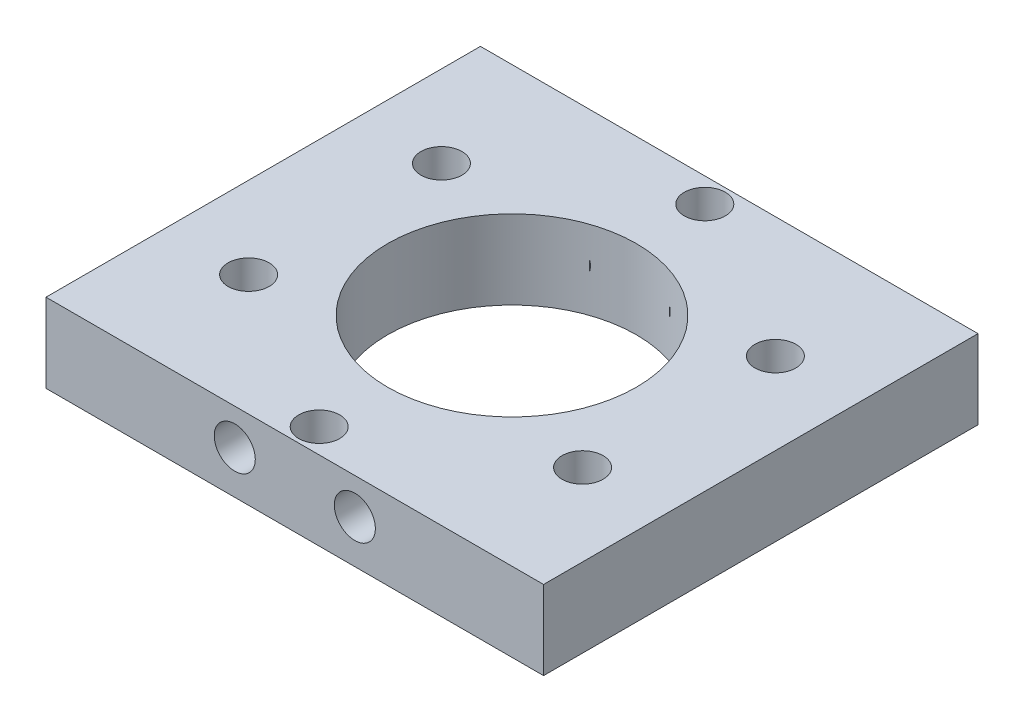
ISO-10303-21;
HEADER;
FILE_DESCRIPTION(('STEP AP214'),'2;1');
FILE_NAME('part.step','',(''),(''),'','','');
FILE_SCHEMA(('AUTOMOTIVE_DESIGN { 1 0 10303 214 1 1 1 1 }'));
ENDSEC;
DATA;
#1=APPLICATION_CONTEXT('core data for automotive mechanical design processes');
#2=APPLICATION_PROTOCOL_DEFINITION('international standard','automotive_design',2000,#1);
#3=PRODUCT_CONTEXT('',#1,'mechanical');
#4=PRODUCT('Part','Part','',(#3));
#5=PRODUCT_RELATED_PRODUCT_CATEGORY('part','',(#4));
#6=PRODUCT_DEFINITION_FORMATION('','',#4);
#7=PRODUCT_DEFINITION_CONTEXT('part definition',#1,'design');
#8=PRODUCT_DEFINITION('design','',#6,#7);
#9=PRODUCT_DEFINITION_SHAPE('','',#8);
#10=(LENGTH_UNIT() NAMED_UNIT(*) SI_UNIT(.MILLI.,.METRE.));
#11=(NAMED_UNIT(*) PLANE_ANGLE_UNIT() SI_UNIT($,.RADIAN.));
#12=(NAMED_UNIT(*) SI_UNIT($,.STERADIAN.) SOLID_ANGLE_UNIT());
#13=UNCERTAINTY_MEASURE_WITH_UNIT(LENGTH_MEASURE(1.E-05),#10,'distance_accuracy_value','');
#14=(GEOMETRIC_REPRESENTATION_CONTEXT(3) GLOBAL_UNCERTAINTY_ASSIGNED_CONTEXT((#13)) GLOBAL_UNIT_ASSIGNED_CONTEXT((#10,
#11,#12)) REPRESENTATION_CONTEXT('',''));
#15=CARTESIAN_POINT('',(0.,0.,0.));
#16=DIRECTION('',(0.,0.,1.));
#17=DIRECTION('',(1.,0.,0.));
#18=AXIS2_PLACEMENT_3D('',#15,#16,#17);
#19=CARTESIAN_POINT('',(0.,0.,34.925));
#20=DIRECTION('',(1.,0.,0.));
#21=DIRECTION('',(0.,0.,-1.));
#22=AXIS2_PLACEMENT_3D('',#19,#20,#21);
#23=PLANE('',#22);
#24=DIRECTION('',(0.,-1.,0.));
#25=VECTOR('',#24,1.);
#26=CARTESIAN_POINT('',(0.,0.,0.));
#27=LINE('',#26,#25);
#28=CARTESIAN_POINT('',(0.,6.35,0.));
#29=VERTEX_POINT('',#28);
#30=CARTESIAN_POINT('',(0.,0.,0.));
#31=VERTEX_POINT('',#30);
#32=EDGE_CURVE('E154',#29,#31,#27,.T.);
#33=ORIENTED_EDGE('',*,*,#32,.T.);
#34=DIRECTION('',(0.,0.,-1.));
#35=VECTOR('',#34,1.);
#36=CARTESIAN_POINT('',(0.,0.,34.925));
#37=LINE('',#36,#35);
#38=CARTESIAN_POINT('',(0.,0.,34.925));
#39=VERTEX_POINT('',#38);
#40=EDGE_CURVE('E51',#39,#31,#37,.T.);
#41=ORIENTED_EDGE('',*,*,#40,.F.);
#42=DIRECTION('',(0.,-1.,0.));
#43=VECTOR('',#42,1.);
#44=CARTESIAN_POINT('',(0.,0.,34.925));
#45=LINE('',#44,#43);
#46=CARTESIAN_POINT('',(0.,6.35,34.925));
#47=VERTEX_POINT('',#46);
#48=EDGE_CURVE('E162',#47,#39,#45,.T.);
#49=ORIENTED_EDGE('',*,*,#48,.F.);
#50=DIRECTION('',(0.,0.,-1.));
#51=VECTOR('',#50,1.);
#52=CARTESIAN_POINT('',(0.,6.35,34.925));
#53=LINE('',#52,#51);
#54=EDGE_CURVE('E176',#47,#29,#53,.T.);
#55=ORIENTED_EDGE('',*,*,#54,.T.);
#56=EDGE_LOOP('',(#33,#41,#49,#55));
#57=FACE_BOUND('',#56,.T.);
#58=ADVANCED_FACE('F43',(#57),#23,.F.);
#59=CARTESIAN_POINT('',(0.,0.,34.925));
#60=DIRECTION('',(0.,1.,0.));
#61=DIRECTION('',(0.,0.,1.));
#62=AXIS2_PLACEMENT_3D('',#59,#60,#61);
#63=PLANE('',#62);
#64=CARTESIAN_POINT('',(33.4233937586587,0.,9.71249999999984));
#65=DIRECTION('',(0.,1.,0.));
#66=DIRECTION('',(-0.866025403784433,0.,0.50000000000001));
#67=AXIS2_PLACEMENT_3D('',#64,#65,#66);
#68=CIRCLE('',#67,1.65);
#69=CARTESIAN_POINT('',(31.9944518424144,0.,10.5374999999999));
#70=VERTEX_POINT('',#69);
#71=EDGE_CURVE('E248',#70,#70,#68,.T.);
#72=ORIENTED_EDGE('',*,*,#71,.T.);
#73=EDGE_LOOP('',(#72));
#74=FACE_BOUND('',#73,.T.);
#75=CARTESIAN_POINT('',(33.4233937586589,0.,25.2124999999999));
#76=DIRECTION('',(0.,1.,0.));
#77=DIRECTION('',(-0.866025403784443,0.,-0.499999999999992));
#78=AXIS2_PLACEMENT_3D('',#75,#76,#77);
#79=CIRCLE('',#78,1.65);
#80=CARTESIAN_POINT('',(31.9944518424145,0.,24.3874999999999));
#81=VERTEX_POINT('',#80);
#82=EDGE_CURVE('E252',#81,#81,#79,.T.);
#83=ORIENTED_EDGE('',*,*,#82,.T.);
#84=EDGE_LOOP('',(#83));
#85=FACE_BOUND('',#84,.T.);
#86=CARTESIAN_POINT('',(20.,0.,32.9625));
#87=DIRECTION('',(0.,1.,0.));
#88=DIRECTION('',(0.,0.,-1.));
#89=AXIS2_PLACEMENT_3D('',#86,#87,#88);
#90=CIRCLE('',#89,1.65);
#91=CARTESIAN_POINT('',(20.,0.,31.3125));
#92=VERTEX_POINT('',#91);
#93=EDGE_CURVE('E256',#92,#92,#90,.T.);
#94=ORIENTED_EDGE('',*,*,#93,.T.);
#95=EDGE_LOOP('',(#94));
#96=FACE_BOUND('',#95,.T.);
#97=CARTESIAN_POINT('',(6.57660624134124,0.,25.2125000000001));
#98=DIRECTION('',(0.,1.,0.));
#99=DIRECTION('',(0.866025403784436,0.,-0.500000000000004));
#100=AXIS2_PLACEMENT_3D('',#97,#98,#99);
#101=CIRCLE('',#100,1.65);
#102=CARTESIAN_POINT('',(8.00554815758555,0.,24.3875000000001));
#103=VERTEX_POINT('',#102);
#104=EDGE_CURVE('E260',#103,#103,#101,.T.);
#105=ORIENTED_EDGE('',*,*,#104,.T.);
#106=EDGE_LOOP('',(#105));
#107=FACE_BOUND('',#106,.T.);
#108=CARTESIAN_POINT('',(6.57660624134118,0.,9.71250000000003));
#109=DIRECTION('',(0.,1.,0.));
#110=DIRECTION('',(0.86602540378444,0.,0.499999999999998));
#111=AXIS2_PLACEMENT_3D('',#108,#109,#110);
#112=CIRCLE('',#111,1.65);
#113=CARTESIAN_POINT('',(8.00554815758551,0.,10.5375));
#114=VERTEX_POINT('',#113);
#115=EDGE_CURVE('E264',#114,#114,#112,.T.);
#116=ORIENTED_EDGE('',*,*,#115,.T.);
#117=EDGE_LOOP('',(#116));
#118=FACE_BOUND('',#117,.T.);
#119=CARTESIAN_POINT('',(20.,0.,1.9625));
#120=DIRECTION('',(0.,1.,0.));
#121=DIRECTION('',(0.,0.,1.));
#122=AXIS2_PLACEMENT_3D('',#119,#120,#121);
#123=CIRCLE('',#122,1.65);
#124=CARTESIAN_POINT('',(20.,0.,3.6125));
#125=VERTEX_POINT('',#124);
#126=EDGE_CURVE('E268',#125,#125,#123,.T.);
#127=ORIENTED_EDGE('',*,*,#126,.T.);
#128=EDGE_LOOP('',(#127));
#129=FACE_BOUND('',#128,.T.);
#130=CARTESIAN_POINT('',(20.,0.,17.4625));
#131=DIRECTION('',(0.,1.,0.));
#132=DIRECTION('',(0.,0.,1.));
#133=AXIS2_PLACEMENT_3D('',#130,#131,#132);
#134=CIRCLE('',#133,10.);
#135=CARTESIAN_POINT('',(20.,0.,27.4625));
#136=VERTEX_POINT('',#135);
#137=EDGE_CURVE('E119',#136,#136,#134,.T.);
#138=ORIENTED_EDGE('',*,*,#137,.T.);
#139=EDGE_LOOP('',(#138));
#140=FACE_BOUND('',#139,.T.);
#141=DIRECTION('',(1.,0.,0.));
#142=VECTOR('',#141,1.);
#143=CARTESIAN_POINT('',(0.,0.,0.));
#144=LINE('',#143,#142);
#145=CARTESIAN_POINT('',(40.,0.,0.));
#146=VERTEX_POINT('',#145);
#147=EDGE_CURVE('E180',#31,#146,#144,.T.);
#148=ORIENTED_EDGE('',*,*,#147,.T.);
#149=DIRECTION('',(0.,0.,-1.));
#150=VECTOR('',#149,1.);
#151=CARTESIAN_POINT('',(40.,0.,34.925));
#152=LINE('',#151,#150);
#153=CARTESIAN_POINT('',(40.,0.,34.925));
#154=VERTEX_POINT('',#153);
#155=EDGE_CURVE('E195',#154,#146,#152,.T.);
#156=ORIENTED_EDGE('',*,*,#155,.F.);
#157=DIRECTION('',(1.,0.,0.));
#158=VECTOR('',#157,1.);
#159=CARTESIAN_POINT('',(0.,0.,34.925));
#160=LINE('',#159,#158);
#161=EDGE_CURVE('E166',#39,#154,#160,.T.);
#162=ORIENTED_EDGE('',*,*,#161,.F.);
#163=ORIENTED_EDGE('',*,*,#40,.T.);
#164=EDGE_LOOP('',(#148,#156,#162,#163));
#165=FACE_BOUND('',#164,.T.);
#166=ADVANCED_FACE('F202',(#74,#85,#96,#107,#118,#129,#140,#165),#63,.F.);
#167=CARTESIAN_POINT('',(40.,0.,34.925));
#168=DIRECTION('',(-1.,0.,0.));
#169=DIRECTION('',(0.,0.,1.));
#170=AXIS2_PLACEMENT_3D('',#167,#168,#169);
#171=PLANE('',#170);
#172=DIRECTION('',(0.,1.,0.));
#173=VECTOR('',#172,1.);
#174=CARTESIAN_POINT('',(40.,0.,0.));
#175=LINE('',#174,#173);
#176=CARTESIAN_POINT('',(40.,6.35,0.));
#177=VERTEX_POINT('',#176);
#178=EDGE_CURVE('E183',#146,#177,#175,.T.);
#179=ORIENTED_EDGE('',*,*,#178,.T.);
#180=DIRECTION('',(0.,0.,-1.));
#181=VECTOR('',#180,1.);
#182=CARTESIAN_POINT('',(40.,6.35,34.925));
#183=LINE('',#182,#181);
#184=CARTESIAN_POINT('',(40.,6.35,34.925));
#185=VERTEX_POINT('',#184);
#186=EDGE_CURVE('E191',#185,#177,#183,.T.);
#187=ORIENTED_EDGE('',*,*,#186,.F.);
#188=DIRECTION('',(0.,1.,0.));
#189=VECTOR('',#188,1.);
#190=CARTESIAN_POINT('',(40.,0.,34.925));
#191=LINE('',#190,#189);
#192=EDGE_CURVE('E170',#154,#185,#191,.T.);
#193=ORIENTED_EDGE('',*,*,#192,.F.);
#194=ORIENTED_EDGE('',*,*,#155,.T.);
#195=EDGE_LOOP('',(#179,#187,#193,#194));
#196=FACE_BOUND('',#195,.T.);
#197=ADVANCED_FACE('F214',(#196),#171,.F.);
#198=CARTESIAN_POINT('',(0.,6.35,34.925));
#199=DIRECTION('',(0.,-1.,0.));
#200=DIRECTION('',(0.,0.,-1.));
#201=AXIS2_PLACEMENT_3D('',#198,#199,#200);
#202=PLANE('',#201);
#203=CARTESIAN_POINT('',(33.4233937586587,6.35,9.71249999999984));
#204=DIRECTION('',(0.,1.,0.));
#205=DIRECTION('',(-0.866025403784433,0.,0.50000000000001));
#206=AXIS2_PLACEMENT_3D('',#203,#204,#205);
#207=CIRCLE('',#206,1.65);
#208=CARTESIAN_POINT('',(31.9944518424144,6.35,10.5374999999999));
#209=VERTEX_POINT('',#208);
#210=EDGE_CURVE('E547',#209,#209,#207,.T.);
#211=ORIENTED_EDGE('',*,*,#210,.F.);
#212=EDGE_LOOP('',(#211));
#213=FACE_BOUND('',#212,.T.);
#214=CARTESIAN_POINT('',(33.4233937586589,6.35,25.2124999999999));
#215=DIRECTION('',(0.,1.,0.));
#216=DIRECTION('',(-0.866025403784443,0.,-0.499999999999992));
#217=AXIS2_PLACEMENT_3D('',#214,#215,#216);
#218=CIRCLE('',#217,1.65);
#219=CARTESIAN_POINT('',(31.9944518424145,6.35,24.3874999999999));
#220=VERTEX_POINT('',#219);
#221=EDGE_CURVE('E553',#220,#220,#218,.T.);
#222=ORIENTED_EDGE('',*,*,#221,.F.);
#223=EDGE_LOOP('',(#222));
#224=FACE_BOUND('',#223,.T.);
#225=CARTESIAN_POINT('',(20.,6.35,32.9625));
#226=DIRECTION('',(0.,1.,0.));
#227=DIRECTION('',(0.,0.,-1.));
#228=AXIS2_PLACEMENT_3D('',#225,#226,#227);
#229=CIRCLE('',#228,1.65);
#230=CARTESIAN_POINT('',(20.,6.35,31.3125));
#231=VERTEX_POINT('',#230);
#232=EDGE_CURVE('E559',#231,#231,#229,.T.);
#233=ORIENTED_EDGE('',*,*,#232,.F.);
#234=EDGE_LOOP('',(#233));
#235=FACE_BOUND('',#234,.T.);
#236=CARTESIAN_POINT('',(6.57660624134124,6.35,25.2125000000001));
#237=DIRECTION('',(0.,1.,0.));
#238=DIRECTION('',(0.866025403784436,0.,-0.500000000000004));
#239=AXIS2_PLACEMENT_3D('',#236,#237,#238);
#240=CIRCLE('',#239,1.65);
#241=CARTESIAN_POINT('',(8.00554815758555,6.35,24.3875000000001));
#242=VERTEX_POINT('',#241);
#243=EDGE_CURVE('E565',#242,#242,#240,.T.);
#244=ORIENTED_EDGE('',*,*,#243,.F.);
#245=EDGE_LOOP('',(#244));
#246=FACE_BOUND('',#245,.T.);
#247=CARTESIAN_POINT('',(6.57660624134118,6.35,9.71250000000003));
#248=DIRECTION('',(0.,1.,0.));
#249=DIRECTION('',(0.86602540378444,0.,0.499999999999998));
#250=AXIS2_PLACEMENT_3D('',#247,#248,#249);
#251=CIRCLE('',#250,1.65);
#252=CARTESIAN_POINT('',(8.00554815758551,6.35,10.5375));
#253=VERTEX_POINT('',#252);
#254=EDGE_CURVE('E541',#253,#253,#251,.T.);
#255=ORIENTED_EDGE('',*,*,#254,.F.);
#256=EDGE_LOOP('',(#255));
#257=FACE_BOUND('',#256,.T.);
#258=CARTESIAN_POINT('',(20.,6.35,1.9625));
#259=DIRECTION('',(0.,1.,0.));
#260=DIRECTION('',(0.,0.,1.));
#261=AXIS2_PLACEMENT_3D('',#258,#259,#260);
#262=CIRCLE('',#261,1.65);
#263=CARTESIAN_POINT('',(20.,6.35,3.6125));
#264=VERTEX_POINT('',#263);
#265=EDGE_CURVE('E278',#264,#264,#262,.T.);
#266=ORIENTED_EDGE('',*,*,#265,.F.);
#267=EDGE_LOOP('',(#266));
#268=FACE_BOUND('',#267,.T.);
#269=CARTESIAN_POINT('',(20.,6.35,17.4625));
#270=DIRECTION('',(0.,1.,0.));
#271=DIRECTION('',(0.,0.,1.));
#272=AXIS2_PLACEMENT_3D('',#269,#270,#271);
#273=CIRCLE('',#272,10.);
#274=CARTESIAN_POINT('',(20.,6.35,27.4625));
#275=VERTEX_POINT('',#274);
#276=EDGE_CURVE('E272',#275,#275,#273,.T.);
#277=ORIENTED_EDGE('',*,*,#276,.F.);
#278=EDGE_LOOP('',(#277));
#279=FACE_BOUND('',#278,.T.);
#280=DIRECTION('',(-1.,0.,0.));
#281=VECTOR('',#280,1.);
#282=CARTESIAN_POINT('',(0.,6.35,0.));
#283=LINE('',#282,#281);
#284=EDGE_CURVE('E167',#177,#29,#283,.T.);
#285=ORIENTED_EDGE('',*,*,#284,.T.);
#286=ORIENTED_EDGE('',*,*,#54,.F.);
#287=DIRECTION('',(-1.,0.,0.));
#288=VECTOR('',#287,1.);
#289=CARTESIAN_POINT('',(0.,6.35,34.925));
#290=LINE('',#289,#288);
#291=EDGE_CURVE('E173',#185,#47,#290,.T.);
#292=ORIENTED_EDGE('',*,*,#291,.F.);
#293=ORIENTED_EDGE('',*,*,#186,.T.);
#294=EDGE_LOOP('',(#285,#286,#292,#293));
#295=FACE_BOUND('',#294,.T.);
#296=ADVANCED_FACE('F218',(#213,#224,#235,#246,#257,#268,#279,#295),#202,.F.);
#297=CARTESIAN_POINT('',(0.,0.,34.925));
#298=DIRECTION('',(0.,0.,-1.));
#299=DIRECTION('',(-1.,0.,0.));
#300=AXIS2_PLACEMENT_3D('',#297,#298,#299);
#301=PLANE('',#300);
#302=CARTESIAN_POINT('',(15.174,3.47207993233842,34.925));
#303=DIRECTION('',(0.,0.,1.));
#304=DIRECTION('',(1.,0.,0.));
#305=AXIS2_PLACEMENT_3D('',#302,#303,#304);
#306=CIRCLE('',#305,1.651);
#307=CARTESIAN_POINT('',(16.825,3.47207993233842,34.925));
#308=VERTEX_POINT('',#307);
#309=EDGE_CURVE('E155',#308,#308,#306,.T.);
#310=ORIENTED_EDGE('',*,*,#309,.F.);
#311=EDGE_LOOP('',(#310));
#312=FACE_BOUND('',#311,.T.);
#313=CARTESIAN_POINT('',(24.826,3.47207993233842,34.925));
#314=DIRECTION('',(0.,0.,1.));
#315=DIRECTION('',(1.,0.,0.));
#316=AXIS2_PLACEMENT_3D('',#313,#314,#315);
#317=CIRCLE('',#316,1.651);
#318=CARTESIAN_POINT('',(26.477,3.47207993233842,34.925));
#319=VERTEX_POINT('',#318);
#320=EDGE_CURVE('E129',#319,#319,#317,.T.);
#321=ORIENTED_EDGE('',*,*,#320,.F.);
#322=EDGE_LOOP('',(#321));
#323=FACE_BOUND('',#322,.T.);
#324=ORIENTED_EDGE('',*,*,#48,.T.);
#325=ORIENTED_EDGE('',*,*,#161,.T.);
#326=ORIENTED_EDGE('',*,*,#192,.T.);
#327=ORIENTED_EDGE('',*,*,#291,.T.);
#328=EDGE_LOOP('',(#324,#325,#326,#327));
#329=FACE_BOUND('',#328,.T.);
#330=ADVANCED_FACE('F220',(#312,#323,#329),#301,.F.);
#331=CARTESIAN_POINT('',(0.,0.,0.));
#332=DIRECTION('',(0.,0.,-1.));
#333=DIRECTION('',(-1.,0.,0.));
#334=AXIS2_PLACEMENT_3D('',#331,#332,#333);
#335=PLANE('',#334);
#336=CARTESIAN_POINT('',(15.174,3.47207993233842,0.));
#337=DIRECTION('',(0.,0.,1.));
#338=DIRECTION('',(1.,0.,0.));
#339=AXIS2_PLACEMENT_3D('',#336,#337,#338);
#340=CIRCLE('',#339,1.651);
#341=CARTESIAN_POINT('',(16.825,3.47207993233842,0.));
#342=VERTEX_POINT('',#341);
#343=EDGE_CURVE('E124',#342,#342,#340,.T.);
#344=ORIENTED_EDGE('',*,*,#343,.T.);
#345=EDGE_LOOP('',(#344));
#346=FACE_BOUND('',#345,.T.);
#347=CARTESIAN_POINT('',(24.826,3.47207993233842,0.));
#348=DIRECTION('',(0.,0.,1.));
#349=DIRECTION('',(1.,0.,0.));
#350=AXIS2_PLACEMENT_3D('',#347,#348,#349);
#351=CIRCLE('',#350,1.651);
#352=CARTESIAN_POINT('',(26.477,3.47207993233842,0.));
#353=VERTEX_POINT('',#352);
#354=EDGE_CURVE('E146',#353,#353,#351,.T.);
#355=ORIENTED_EDGE('',*,*,#354,.T.);
#356=EDGE_LOOP('',(#355));
#357=FACE_BOUND('',#356,.T.);
#358=ORIENTED_EDGE('',*,*,#32,.F.);
#359=ORIENTED_EDGE('',*,*,#284,.F.);
#360=ORIENTED_EDGE('',*,*,#178,.F.);
#361=ORIENTED_EDGE('',*,*,#147,.F.);
#362=EDGE_LOOP('',(#358,#359,#360,#361));
#363=FACE_BOUND('',#362,.T.);
#364=ADVANCED_FACE('F210',(#346,#357,#363),#335,.T.);
#365=CARTESIAN_POINT('',(24.826,3.47207993233842,26.925));
#366=DIRECTION('',(0.,0.,1.));
#367=DIRECTION('',(1.,0.,0.));
#368=AXIS2_PLACEMENT_3D('',#365,#366,#367);
#369=CYLINDRICAL_SURFACE('',#368,1.651);
#370=CARTESIAN_POINT('',(24.826,3.47207993233842,26.925));
#371=DIRECTION('',(0.,0.,1.));
#372=DIRECTION('',(1.,0.,0.));
#373=AXIS2_PLACEMENT_3D('',#370,#371,#372);
#374=CIRCLE('',#373,1.651);
#375=CARTESIAN_POINT('',(23.2343614130149,3.03334583471187,26.925));
#376=VERTEX_POINT('',#375);
#377=CARTESIAN_POINT('',(23.2343614130149,3.91081402996496,26.925));
#378=VERTEX_POINT('',#377);
#379=EDGE_CURVE('E123',#376,#378,#374,.T.);
#380=ORIENTED_EDGE('',*,*,#379,.F.);
#381=CARTESIAN_POINT('',(23.2343614130149,3.03334583471187,26.925));
#382=CARTESIAN_POINT('',(23.2225488140386,3.07620002651683,26.9290360586805));
#383=CARTESIAN_POINT('',(23.212460085818,3.11956131176623,26.9324615707877));
#384=CARTESIAN_POINT('',(23.1958033275133,3.20704130256521,26.9380962208144));
#385=CARTESIAN_POINT('',(23.1892359888891,3.25116015511668,26.940305119842));
#386=CARTESIAN_POINT('',(23.1751633547283,3.38208507522379,26.9450340501303));
#387=CARTESIAN_POINT('',(23.1727098945232,3.4695701143414,26.9458507814205));
#388=CARTESIAN_POINT('',(23.1802083612192,3.61605668222609,26.9433374939209));
#389=CARTESIAN_POINT('',(23.1864796528042,3.67530942364082,26.9412381408081));
#390=CARTESIAN_POINT('',(23.2054896066706,3.79364056001316,26.9348232564083));
#391=CARTESIAN_POINT('',(23.2183319933763,3.85270037950822,26.9304721686244));
#392=CARTESIAN_POINT('',(23.2343614130149,3.91081402996496,26.925));
#393=B_SPLINE_CURVE_WITH_KNOTS('',3,(#381,#382,#383,#384,#385,#386,#387,#388,#389,#390,#391,
#392),.UNSPECIFIED.,.F.,.F.,(4,2,2,2,2,4),(0.,0.133816086275753,0.267658439052666,
0.528834960519421,0.707346732145841,0.888767461860831),.UNSPECIFIED.);
#394=EDGE_CURVE('E57',#376,#378,#393,.T.);
#395=ORIENTED_EDGE('',*,*,#394,.T.);
#396=EDGE_LOOP('',(#380,#395));
#397=FACE_BOUND('',#396,.T.);
#398=ORIENTED_EDGE('',*,*,#320,.T.);
#399=EDGE_LOOP('',(#398));
#400=FACE_BOUND('',#399,.T.);
#401=ADVANCED_FACE('F228',(#397,#400),#369,.F.);
#402=CARTESIAN_POINT('',(24.826,3.47207993233842,26.925));
#403=DIRECTION('',(0.,0.,1.));
#404=DIRECTION('',(1.,0.,0.));
#405=AXIS2_PLACEMENT_3D('',#402,#403,#404);
#406=PLANE('',#405);
#407=DIRECTION('',(0.,1.,0.));
#408=VECTOR('',#407,1.);
#409=CARTESIAN_POINT('',(23.2343614130149,0.,26.925));
#410=LINE('',#409,#408);
#411=EDGE_CURVE('E313',#376,#378,#410,.T.);
#412=ORIENTED_EDGE('',*,*,#411,.F.);
#413=ORIENTED_EDGE('',*,*,#379,.T.);
#414=EDGE_LOOP('',(#412,#413));
#415=FACE_BOUND('',#414,.T.);
#416=ADVANCED_FACE('F320',(#415),#406,.T.);
#417=CARTESIAN_POINT('',(15.174,3.47207993233842,26.925));
#418=DIRECTION('',(0.,0.,1.));
#419=DIRECTION('',(1.,0.,0.));
#420=AXIS2_PLACEMENT_3D('',#417,#418,#419);
#421=CYLINDRICAL_SURFACE('',#420,1.651);
#422=CARTESIAN_POINT('',(15.174,3.47207993233842,26.925));
#423=DIRECTION('',(0.,0.,1.));
#424=DIRECTION('',(1.,0.,0.));
#425=AXIS2_PLACEMENT_3D('',#422,#423,#424);
#426=CIRCLE('',#425,1.651);
#427=CARTESIAN_POINT('',(16.7656385869851,3.91081402996496,26.925));
#428=VERTEX_POINT('',#427);
#429=CARTESIAN_POINT('',(16.7656385869851,3.03334583471187,26.925));
#430=VERTEX_POINT('',#429);
#431=EDGE_CURVE('E150',#428,#430,#426,.T.);
#432=ORIENTED_EDGE('',*,*,#431,.F.);
#433=CARTESIAN_POINT('',(16.7656385869851,3.91081402996496,26.925));
#434=CARTESIAN_POINT('',(16.7774511859614,3.86795983816,26.9290360586805));
#435=CARTESIAN_POINT('',(16.787539914182,3.8245985529106,26.9324615707877));
#436=CARTESIAN_POINT('',(16.8041966724867,3.73711856211162,26.9380962208144));
#437=CARTESIAN_POINT('',(16.8107640111109,3.69299970956014,26.940305119842));
#438=CARTESIAN_POINT('',(16.8248366452717,3.56207478945304,26.9450340501303));
#439=CARTESIAN_POINT('',(16.8272901054768,3.47458975033543,26.9458507814205));
#440=CARTESIAN_POINT('',(16.8197916387808,3.32810318245074,26.9433374939209));
#441=CARTESIAN_POINT('',(16.8135203471958,3.26885044103601,26.9412381408081));
#442=CARTESIAN_POINT('',(16.7945103933294,3.15051930466367,26.9348232564083));
#443=CARTESIAN_POINT('',(16.7816680066237,3.09145948516861,26.9304721686244));
#444=CARTESIAN_POINT('',(16.7656385869851,3.03334583471187,26.925));
#445=B_SPLINE_CURVE_WITH_KNOTS('',3,(#433,#434,#435,#436,#437,#438,#439,#440,#441,#442,#443,
#444),.UNSPECIFIED.,.F.,.F.,(4,2,2,2,2,4),(0.,0.133816086275753,0.267658439052666,
0.528834960519421,0.707346732145841,0.888767461860832),.UNSPECIFIED.);
#446=EDGE_CURVE('E64',#428,#430,#445,.T.);
#447=ORIENTED_EDGE('',*,*,#446,.T.);
#448=EDGE_LOOP('',(#432,#447));
#449=FACE_BOUND('',#448,.T.);
#450=ORIENTED_EDGE('',*,*,#309,.T.);
#451=EDGE_LOOP('',(#450));
#452=FACE_BOUND('',#451,.T.);
#453=ADVANCED_FACE('F315',(#449,#452),#421,.F.);
#454=CARTESIAN_POINT('',(15.174,3.47207993233842,26.925));
#455=DIRECTION('',(0.,0.,1.));
#456=DIRECTION('',(1.,0.,0.));
#457=AXIS2_PLACEMENT_3D('',#454,#455,#456);
#458=PLANE('',#457);
#459=DIRECTION('',(0.,1.,0.));
#460=VECTOR('',#459,1.);
#461=CARTESIAN_POINT('',(16.7656385869851,0.,26.925));
#462=LINE('',#461,#460);
#463=EDGE_CURVE('E314',#428,#430,#462,.F.);
#464=ORIENTED_EDGE('',*,*,#463,.F.);
#465=ORIENTED_EDGE('',*,*,#431,.T.);
#466=EDGE_LOOP('',(#464,#465));
#467=FACE_BOUND('',#466,.T.);
#468=ADVANCED_FACE('F319',(#467),#458,.T.);
#469=CARTESIAN_POINT('',(24.826,3.47207993233842,8.));
#470=DIRECTION('',(0.,0.,-1.));
#471=DIRECTION('',(-1.,0.,0.));
#472=AXIS2_PLACEMENT_3D('',#469,#470,#471);
#473=CYLINDRICAL_SURFACE('',#472,1.651);
#474=CARTESIAN_POINT('',(23.2343614130149,3.03334583471187,8.));
#475=CARTESIAN_POINT('',(23.2225488140386,3.07620002651683,7.99596394131952));
#476=CARTESIAN_POINT('',(23.212460085818,3.11956131176623,7.99253842921227));
#477=CARTESIAN_POINT('',(23.1958033275133,3.20704130256521,7.98690377918565));
#478=CARTESIAN_POINT('',(23.1892359888891,3.25116015511668,7.984694880158));
#479=CARTESIAN_POINT('',(23.1751633547283,3.38208507522379,7.97996594986966));
#480=CARTESIAN_POINT('',(23.1727098945232,3.4695701143414,7.97914921857955));
#481=CARTESIAN_POINT('',(23.1802083612192,3.61605668222609,7.98166250607909));
#482=CARTESIAN_POINT('',(23.1864796528042,3.67530942364082,7.9837618591919));
#483=CARTESIAN_POINT('',(23.2054896066706,3.79364056001316,7.99017674359166));
#484=CARTESIAN_POINT('',(23.2183319933763,3.85270037950822,7.99452783137564));
#485=CARTESIAN_POINT('',(23.2343614130149,3.91081402996496,8.));
#486=B_SPLINE_CURVE_WITH_KNOTS('',3,(#474,#475,#476,#477,#478,#479,#480,#481,#482,#483,#484,
#485),.UNSPECIFIED.,.F.,.F.,(4,2,2,2,2,4),(0.,0.133816086275753,0.267658439052666,
0.528834960519421,0.707346732145841,0.888767461860831),.UNSPECIFIED.);
#487=CARTESIAN_POINT('',(23.2343614130149,3.03334583471187,8.));
#488=VERTEX_POINT('',#487);
#489=CARTESIAN_POINT('',(23.2343614130149,3.91081402996496,8.));
#490=VERTEX_POINT('',#489);
#491=EDGE_CURVE('E299',#488,#490,#486,.T.);
#492=ORIENTED_EDGE('',*,*,#491,.F.);
#493=CARTESIAN_POINT('',(24.826,3.47207993233842,8.));
#494=DIRECTION('',(0.,0.,1.));
#495=DIRECTION('',(1.,0.,0.));
#496=AXIS2_PLACEMENT_3D('',#493,#494,#495);
#497=CIRCLE('',#496,1.651);
#498=EDGE_CURVE('E132',#488,#490,#497,.T.);
#499=ORIENTED_EDGE('',*,*,#498,.T.);
#500=EDGE_LOOP('',(#492,#499));
#501=FACE_BOUND('',#500,.T.);
#502=ORIENTED_EDGE('',*,*,#354,.F.);
#503=EDGE_LOOP('',(#502));
#504=FACE_BOUND('',#503,.T.);
#505=ADVANCED_FACE('F341',(#501,#504),#473,.F.);
#506=CARTESIAN_POINT('',(24.826,3.47207993233842,8.));
#507=DIRECTION('',(0.,0.,-1.));
#508=DIRECTION('',(1.,0.,0.));
#509=AXIS2_PLACEMENT_3D('',#506,#507,#508);
#510=PLANE('',#509);
#511=DIRECTION('',(0.,1.,0.));
#512=VECTOR('',#511,1.);
#513=CARTESIAN_POINT('',(23.2343614130149,0.,8.));
#514=LINE('',#513,#512);
#515=EDGE_CURVE('E118',#490,#488,#514,.F.);
#516=ORIENTED_EDGE('',*,*,#515,.F.);
#517=ORIENTED_EDGE('',*,*,#498,.F.);
#518=EDGE_LOOP('',(#516,#517));
#519=FACE_BOUND('',#518,.T.);
#520=ADVANCED_FACE('F343',(#519),#510,.T.);
#521=CARTESIAN_POINT('',(15.174,3.47207993233842,8.));
#522=DIRECTION('',(0.,0.,-1.));
#523=DIRECTION('',(-1.,0.,0.));
#524=AXIS2_PLACEMENT_3D('',#521,#522,#523);
#525=CYLINDRICAL_SURFACE('',#524,1.651);
#526=CARTESIAN_POINT('',(16.7656385869851,3.91081402996496,8.));
#527=CARTESIAN_POINT('',(16.7774511859614,3.86795983816,7.99596394131952));
#528=CARTESIAN_POINT('',(16.787539914182,3.8245985529106,7.99253842921227));
#529=CARTESIAN_POINT('',(16.8041966724867,3.73711856211162,7.98690377918565));
#530=CARTESIAN_POINT('',(16.8107640111109,3.69299970956015,7.984694880158));
#531=CARTESIAN_POINT('',(16.8248366452717,3.56207478945304,7.97996594986966));
#532=CARTESIAN_POINT('',(16.8272901054768,3.47458975033543,7.97914921857955));
#533=CARTESIAN_POINT('',(16.8197916387808,3.32810318245074,7.98166250607909));
#534=CARTESIAN_POINT('',(16.8135203471958,3.26885044103601,7.9837618591919));
#535=CARTESIAN_POINT('',(16.7945103933294,3.15051930466367,7.99017674359166));
#536=CARTESIAN_POINT('',(16.7816680066237,3.09145948516861,7.99452783137564));
#537=CARTESIAN_POINT('',(16.7656385869851,3.03334583471187,8.));
#538=B_SPLINE_CURVE_WITH_KNOTS('',3,(#526,#527,#528,#529,#530,#531,#532,#533,#534,#535,#536,
#537),.UNSPECIFIED.,.F.,.F.,(4,2,2,2,2,4),(0.,0.133816086275753,0.267658439052666,
0.528834960519421,0.70734673214584,0.888767461860832),.UNSPECIFIED.);
#539=CARTESIAN_POINT('',(16.7656385869851,3.91081402996496,8.));
#540=VERTEX_POINT('',#539);
#541=CARTESIAN_POINT('',(16.7656385869851,3.03334583471187,8.));
#542=VERTEX_POINT('',#541);
#543=EDGE_CURVE('E109',#540,#542,#538,.T.);
#544=ORIENTED_EDGE('',*,*,#543,.F.);
#545=CARTESIAN_POINT('',(15.174,3.47207993233842,8.));
#546=DIRECTION('',(0.,0.,1.));
#547=DIRECTION('',(1.,0.,0.));
#548=AXIS2_PLACEMENT_3D('',#545,#546,#547);
#549=CIRCLE('',#548,1.651);
#550=EDGE_CURVE('E116',#540,#542,#549,.T.);
#551=ORIENTED_EDGE('',*,*,#550,.T.);
#552=EDGE_LOOP('',(#544,#551));
#553=FACE_BOUND('',#552,.T.);
#554=ORIENTED_EDGE('',*,*,#343,.F.);
#555=EDGE_LOOP('',(#554));
#556=FACE_BOUND('',#555,.T.);
#557=ADVANCED_FACE('F114',(#553,#556),#525,.F.);
#558=CARTESIAN_POINT('',(15.174,3.47207993233842,8.));
#559=DIRECTION('',(0.,0.,-1.));
#560=DIRECTION('',(1.,0.,0.));
#561=AXIS2_PLACEMENT_3D('',#558,#559,#560);
#562=PLANE('',#561);
#563=DIRECTION('',(0.,1.,0.));
#564=VECTOR('',#563,1.);
#565=CARTESIAN_POINT('',(16.7656385869851,0.,8.));
#566=LINE('',#565,#564);
#567=EDGE_CURVE('E11',#542,#540,#566,.T.);
#568=ORIENTED_EDGE('',*,*,#567,.F.);
#569=ORIENTED_EDGE('',*,*,#550,.F.);
#570=EDGE_LOOP('',(#568,#569));
#571=FACE_BOUND('',#570,.T.);
#572=ADVANCED_FACE('F121',(#571),#562,.T.);
#573=CARTESIAN_POINT('',(20.,0.,17.4625));
#574=DIRECTION('',(0.,1.,0.));
#575=DIRECTION('',(0.,0.,1.));
#576=AXIS2_PLACEMENT_3D('',#573,#574,#575);
#577=CYLINDRICAL_SURFACE('',#576,10.);
#578=ORIENTED_EDGE('',*,*,#491,.T.);
#579=ORIENTED_EDGE('',*,*,#515,.T.);
#580=EDGE_LOOP('',(#578,#579));
#581=FACE_BOUND('',#580,.T.);
#582=ORIENTED_EDGE('',*,*,#543,.T.);
#583=ORIENTED_EDGE('',*,*,#567,.T.);
#584=EDGE_LOOP('',(#582,#583));
#585=FACE_BOUND('',#584,.T.);
#586=ORIENTED_EDGE('',*,*,#137,.F.);
#587=EDGE_LOOP('',(#586));
#588=FACE_BOUND('',#587,.T.);
#589=ORIENTED_EDGE('',*,*,#276,.T.);
#590=EDGE_LOOP('',(#589));
#591=FACE_BOUND('',#590,.T.);
#592=ORIENTED_EDGE('',*,*,#463,.T.);
#593=ORIENTED_EDGE('',*,*,#446,.F.);
#594=EDGE_LOOP('',(#592,#593));
#595=FACE_BOUND('',#594,.T.);
#596=ORIENTED_EDGE('',*,*,#411,.T.);
#597=ORIENTED_EDGE('',*,*,#394,.F.);
#598=EDGE_LOOP('',(#596,#597));
#599=FACE_BOUND('',#598,.T.);
#600=ADVANCED_FACE('F107',(#581,#585,#588,#591,#595,#599),#577,.F.);
#601=CARTESIAN_POINT('',(20.,0.,1.9625));
#602=DIRECTION('',(0.,1.,0.));
#603=DIRECTION('',(0.,0.,1.));
#604=AXIS2_PLACEMENT_3D('',#601,#602,#603);
#605=CYLINDRICAL_SURFACE('',#604,1.65);
#606=ORIENTED_EDGE('',*,*,#126,.F.);
#607=EDGE_LOOP('',(#606));
#608=FACE_BOUND('',#607,.T.);
#609=ORIENTED_EDGE('',*,*,#265,.T.);
#610=EDGE_LOOP('',(#609));
#611=FACE_BOUND('',#610,.T.);
#612=ADVANCED_FACE('F293',(#608,#611),#605,.F.);
#613=CARTESIAN_POINT('',(6.57660624134118,0.,9.71250000000003));
#614=DIRECTION('',(0.,1.,0.));
#615=DIRECTION('',(0.,0.,1.));
#616=AXIS2_PLACEMENT_3D('',#613,#614,#615);
#617=CYLINDRICAL_SURFACE('',#616,1.65);
#618=ORIENTED_EDGE('',*,*,#115,.F.);
#619=EDGE_LOOP('',(#618));
#620=FACE_BOUND('',#619,.T.);
#621=ORIENTED_EDGE('',*,*,#254,.T.);
#622=EDGE_LOOP('',(#621));
#623=FACE_BOUND('',#622,.T.);
#624=ADVANCED_FACE('F423',(#620,#623),#617,.F.);
#625=CARTESIAN_POINT('',(6.57660624134124,0.,25.2125000000001));
#626=DIRECTION('',(0.,1.,0.));
#627=DIRECTION('',(0.,0.,1.));
#628=AXIS2_PLACEMENT_3D('',#625,#626,#627);
#629=CYLINDRICAL_SURFACE('',#628,1.65);
#630=ORIENTED_EDGE('',*,*,#104,.F.);
#631=EDGE_LOOP('',(#630));
#632=FACE_BOUND('',#631,.T.);
#633=ORIENTED_EDGE('',*,*,#243,.T.);
#634=EDGE_LOOP('',(#633));
#635=FACE_BOUND('',#634,.T.);
#636=ADVANCED_FACE('F428',(#632,#635),#629,.F.);
#637=CARTESIAN_POINT('',(20.,0.,32.9625));
#638=DIRECTION('',(0.,1.,0.));
#639=DIRECTION('',(0.,0.,1.));
#640=AXIS2_PLACEMENT_3D('',#637,#638,#639);
#641=CYLINDRICAL_SURFACE('',#640,1.65);
#642=ORIENTED_EDGE('',*,*,#93,.F.);
#643=EDGE_LOOP('',(#642));
#644=FACE_BOUND('',#643,.T.);
#645=ORIENTED_EDGE('',*,*,#232,.T.);
#646=EDGE_LOOP('',(#645));
#647=FACE_BOUND('',#646,.T.);
#648=ADVANCED_FACE('F438',(#644,#647),#641,.F.);
#649=CARTESIAN_POINT('',(33.4233937586589,0.,25.2124999999999));
#650=DIRECTION('',(0.,1.,0.));
#651=DIRECTION('',(0.,0.,1.));
#652=AXIS2_PLACEMENT_3D('',#649,#650,#651);
#653=CYLINDRICAL_SURFACE('',#652,1.65);
#654=ORIENTED_EDGE('',*,*,#82,.F.);
#655=EDGE_LOOP('',(#654));
#656=FACE_BOUND('',#655,.T.);
#657=ORIENTED_EDGE('',*,*,#221,.T.);
#658=EDGE_LOOP('',(#657));
#659=FACE_BOUND('',#658,.T.);
#660=ADVANCED_FACE('F449',(#656,#659),#653,.F.);
#661=CARTESIAN_POINT('',(33.4233937586587,0.,9.71249999999984));
#662=DIRECTION('',(0.,1.,0.));
#663=DIRECTION('',(0.,0.,1.));
#664=AXIS2_PLACEMENT_3D('',#661,#662,#663);
#665=CYLINDRICAL_SURFACE('',#664,1.65);
#666=ORIENTED_EDGE('',*,*,#71,.F.);
#667=EDGE_LOOP('',(#666));
#668=FACE_BOUND('',#667,.T.);
#669=ORIENTED_EDGE('',*,*,#210,.T.);
#670=EDGE_LOOP('',(#669));
#671=FACE_BOUND('',#670,.T.);
#672=ADVANCED_FACE('F460',(#668,#671),#665,.F.);
#673=CLOSED_SHELL('',(#58,#166,#197,#296,#330,#364,#401,#416,#453,#468,#505,#520,#557,#572,#600,
#612,#624,#636,#648,#660,#672));
#674=MANIFOLD_SOLID_BREP('B2',#673);
#675=ADVANCED_BREP_SHAPE_REPRESENTATION('',(#18,#674),#14);
#676=SHAPE_DEFINITION_REPRESENTATION(#9,#675);
ENDSEC;
END-ISO-10303-21;
